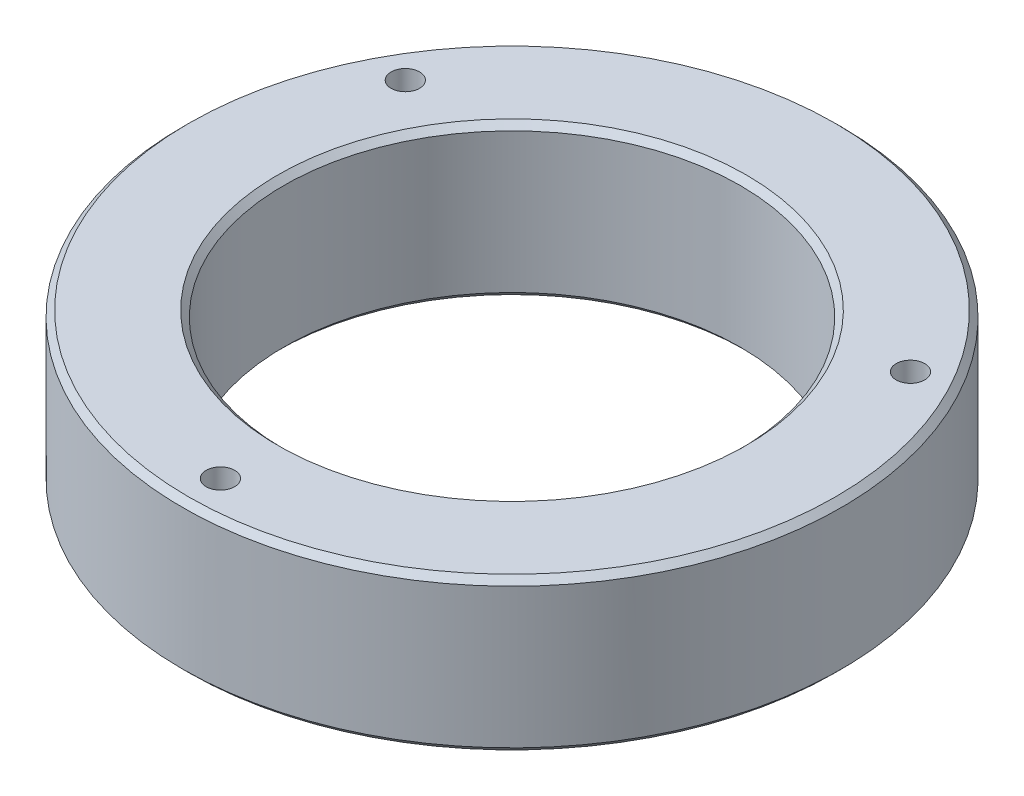
ISO-10303-21;
HEADER;
FILE_DESCRIPTION(('STEP AP214'),'2;1');
FILE_NAME('part.step','',(''),(''),'','','');
FILE_SCHEMA(('AUTOMOTIVE_DESIGN { 1 0 10303 214 1 1 1 1 }'));
ENDSEC;
DATA;
#1=APPLICATION_CONTEXT('core data for automotive mechanical design processes');
#2=APPLICATION_PROTOCOL_DEFINITION('international standard','automotive_design',2000,#1);
#3=PRODUCT_CONTEXT('',#1,'mechanical');
#4=PRODUCT('Part','Part','',(#3));
#5=PRODUCT_RELATED_PRODUCT_CATEGORY('part','',(#4));
#6=PRODUCT_DEFINITION_FORMATION('','',#4);
#7=PRODUCT_DEFINITION_CONTEXT('part definition',#1,'design');
#8=PRODUCT_DEFINITION('design','',#6,#7);
#9=PRODUCT_DEFINITION_SHAPE('','',#8);
#10=(LENGTH_UNIT() NAMED_UNIT(*) SI_UNIT(.MILLI.,.METRE.));
#11=(NAMED_UNIT(*) PLANE_ANGLE_UNIT() SI_UNIT($,.RADIAN.));
#12=(NAMED_UNIT(*) SI_UNIT($,.STERADIAN.) SOLID_ANGLE_UNIT());
#13=UNCERTAINTY_MEASURE_WITH_UNIT(LENGTH_MEASURE(1.E-05),#10,'distance_accuracy_value','');
#14=(GEOMETRIC_REPRESENTATION_CONTEXT(3) GLOBAL_UNCERTAINTY_ASSIGNED_CONTEXT((#13)) GLOBAL_UNIT_ASSIGNED_CONTEXT((#10,
#11,#12)) REPRESENTATION_CONTEXT('',''));
#15=CARTESIAN_POINT('',(0.,0.,0.));
#16=DIRECTION('',(0.,0.,1.));
#17=DIRECTION('',(1.,0.,0.));
#18=AXIS2_PLACEMENT_3D('',#15,#16,#17);
#19=CARTESIAN_POINT('',(-57.15,-19.05,0.));
#20=DIRECTION('',(0.,1.,0.));
#21=DIRECTION('',(0.,0.,1.));
#22=AXIS2_PLACEMENT_3D('',#19,#20,#21);
#23=PLANE('',#22);
#24=CARTESIAN_POINT('',(0.,-19.05,0.));
#25=DIRECTION('',(0.,1.,0.));
#26=DIRECTION('',(0.,0.,1.));
#27=AXIS2_PLACEMENT_3D('',#24,#25,#26);
#28=CIRCLE('',#27,58.674);
#29=CARTESIAN_POINT('',(0.,-19.05,-58.674));
#30=VERTEX_POINT('',#29);
#31=EDGE_CURVE('E134',#30,#30,#28,.T.);
#32=ORIENTED_EDGE('',*,*,#31,.T.);
#33=EDGE_LOOP('',(#32));
#34=FACE_BOUND('',#33,.T.);
#35=CARTESIAN_POINT('',(0.,-19.05,0.));
#36=DIRECTION('',(0.,1.,0.));
#37=DIRECTION('',(0.,0.,1.));
#38=AXIS2_PLACEMENT_3D('',#35,#36,#37);
#39=CIRCLE('',#38,81.0006);
#40=CARTESIAN_POINT('',(0.,-19.05,81.0006));
#41=VERTEX_POINT('',#40);
#42=EDGE_CURVE('E131',#41,#41,#39,.F.);
#43=ORIENTED_EDGE('',*,*,#42,.T.);
#44=EDGE_LOOP('',(#43));
#45=FACE_BOUND('',#44,.T.);
#46=CARTESIAN_POINT('',(69.85,-19.05,0.));
#47=DIRECTION('',(0.,-1.,0.));
#48=DIRECTION('',(0.,0.,-1.));
#49=AXIS2_PLACEMENT_3D('',#46,#47,#48);
#50=CIRCLE('',#49,3.96874999999999);
#51=CARTESIAN_POINT('',(69.85,-19.05,-3.96874999999999));
#52=VERTEX_POINT('',#51);
#53=EDGE_CURVE('E73',#52,#52,#50,.T.);
#54=ORIENTED_EDGE('',*,*,#53,.F.);
#55=EDGE_LOOP('',(#54));
#56=FACE_BOUND('',#55,.T.);
#57=CARTESIAN_POINT('',(-69.85,-19.05,0.));
#58=DIRECTION('',(0.,-1.,0.));
#59=DIRECTION('',(0.,0.,-1.));
#60=AXIS2_PLACEMENT_3D('',#57,#58,#59);
#61=CIRCLE('',#60,3.96874999999999);
#62=CARTESIAN_POINT('',(-69.85,-19.05,-3.96874999999999));
#63=VERTEX_POINT('',#62);
#64=EDGE_CURVE('E72',#63,#63,#61,.T.);
#65=ORIENTED_EDGE('',*,*,#64,.F.);
#66=EDGE_LOOP('',(#65));
#67=FACE_BOUND('',#66,.T.);
#68=CARTESIAN_POINT('',(0.,-19.05,73.025));
#69=DIRECTION('',(0.,-1.,0.));
#70=DIRECTION('',(0.,0.,-1.));
#71=AXIS2_PLACEMENT_3D('',#68,#69,#70);
#72=CIRCLE('',#71,5.56259999999999);
#73=CARTESIAN_POINT('',(0.,-19.05,67.4624));
#74=VERTEX_POINT('',#73);
#75=EDGE_CURVE('E83',#74,#74,#72,.T.);
#76=ORIENTED_EDGE('',*,*,#75,.F.);
#77=EDGE_LOOP('',(#76));
#78=FACE_BOUND('',#77,.T.);
#79=CARTESIAN_POINT('',(63.246,-19.05,-36.5252));
#80=DIRECTION('',(0.,-1.,0.));
#81=DIRECTION('',(0.,0.,-1.));
#82=AXIS2_PLACEMENT_3D('',#79,#80,#81);
#83=CIRCLE('',#82,5.5626);
#84=CARTESIAN_POINT('',(63.246,-19.05,-42.0878));
#85=VERTEX_POINT('',#84);
#86=EDGE_CURVE('E95',#85,#85,#83,.T.);
#87=ORIENTED_EDGE('',*,*,#86,.F.);
#88=EDGE_LOOP('',(#87));
#89=FACE_BOUND('',#88,.T.);
#90=CARTESIAN_POINT('',(-63.246,-19.05,-36.5252));
#91=DIRECTION('',(0.,-1.,0.));
#92=DIRECTION('',(0.,0.,-1.));
#93=AXIS2_PLACEMENT_3D('',#90,#91,#92);
#94=CIRCLE('',#93,5.56259999999999);
#95=CARTESIAN_POINT('',(-63.246,-19.05,-42.0878));
#96=VERTEX_POINT('',#95);
#97=EDGE_CURVE('E107',#96,#96,#94,.T.);
#98=ORIENTED_EDGE('',*,*,#97,.F.);
#99=EDGE_LOOP('',(#98));
#100=FACE_BOUND('',#99,.T.);
#101=ADVANCED_FACE('F47',(#34,#45,#56,#67,#78,#89,#100),#23,.F.);
#102=CARTESIAN_POINT('',(0.,-44.45,0.));
#103=DIRECTION('',(0.,-1.,0.));
#104=DIRECTION('',(0.,0.,-1.));
#105=AXIS2_PLACEMENT_3D('',#102,#103,#104);
#106=CYLINDRICAL_SURFACE('',#105,82.5246);
#107=CARTESIAN_POINT('',(0.,17.526,0.));
#108=DIRECTION('',(0.,-1.,0.));
#109=DIRECTION('',(0.,0.,-1.));
#110=AXIS2_PLACEMENT_3D('',#107,#108,#109);
#111=CIRCLE('',#110,82.5246);
#112=CARTESIAN_POINT('',(0.,17.526,-82.5246));
#113=VERTEX_POINT('',#112);
#114=EDGE_CURVE('E11',#113,#113,#111,.T.);
#115=ORIENTED_EDGE('',*,*,#114,.T.);
#116=EDGE_LOOP('',(#115));
#117=FACE_BOUND('',#116,.T.);
#118=CARTESIAN_POINT('',(0.,-17.526,0.));
#119=DIRECTION('',(0.,1.,0.));
#120=DIRECTION('',(0.,0.,1.));
#121=AXIS2_PLACEMENT_3D('',#118,#119,#120);
#122=CIRCLE('',#121,82.5246);
#123=CARTESIAN_POINT('',(0.,-17.526,82.5246));
#124=VERTEX_POINT('',#123);
#125=EDGE_CURVE('E56',#124,#124,#122,.T.);
#126=ORIENTED_EDGE('',*,*,#125,.T.);
#127=EDGE_LOOP('',(#126));
#128=FACE_BOUND('',#127,.T.);
#129=ADVANCED_FACE('F139',(#117,#128),#106,.T.);
#130=CARTESIAN_POINT('',(-82.5246,19.05,0.));
#131=DIRECTION('',(0.,-1.,0.));
#132=DIRECTION('',(0.,0.,-1.));
#133=AXIS2_PLACEMENT_3D('',#130,#131,#132);
#134=PLANE('',#133);
#135=CARTESIAN_POINT('',(0.,19.05,0.));
#136=DIRECTION('',(0.,-1.,0.));
#137=DIRECTION('',(0.,0.,-1.));
#138=AXIS2_PLACEMENT_3D('',#135,#136,#137);
#139=CIRCLE('',#138,58.674);
#140=CARTESIAN_POINT('',(0.,19.05,-58.674));
#141=VERTEX_POINT('',#140);
#142=EDGE_CURVE('E122',#141,#141,#139,.T.);
#143=ORIENTED_EDGE('',*,*,#142,.T.);
#144=EDGE_LOOP('',(#143));
#145=FACE_BOUND('',#144,.T.);
#146=CARTESIAN_POINT('',(0.,19.05,0.));
#147=DIRECTION('',(0.,-1.,0.));
#148=DIRECTION('',(0.,0.,-1.));
#149=AXIS2_PLACEMENT_3D('',#146,#147,#148);
#150=CIRCLE('',#149,81.0006);
#151=CARTESIAN_POINT('',(0.,19.05,-81.0006));
#152=VERTEX_POINT('',#151);
#153=EDGE_CURVE('E119',#152,#152,#150,.F.);
#154=ORIENTED_EDGE('',*,*,#153,.T.);
#155=EDGE_LOOP('',(#154));
#156=FACE_BOUND('',#155,.T.);
#157=CARTESIAN_POINT('',(0.,19.05,73.025));
#158=DIRECTION('',(0.,-1.,0.));
#159=DIRECTION('',(0.,0.,-1.));
#160=AXIS2_PLACEMENT_3D('',#157,#158,#159);
#161=CIRCLE('',#160,3.56869999999999);
#162=CARTESIAN_POINT('',(0.,19.05,69.4563));
#163=VERTEX_POINT('',#162);
#164=EDGE_CURVE('E92',#163,#163,#161,.T.);
#165=ORIENTED_EDGE('',*,*,#164,.T.);
#166=EDGE_LOOP('',(#165));
#167=FACE_BOUND('',#166,.T.);
#168=CARTESIAN_POINT('',(63.246,19.05,-36.5252));
#169=DIRECTION('',(0.,-1.,0.));
#170=DIRECTION('',(0.,0.,-1.));
#171=AXIS2_PLACEMENT_3D('',#168,#169,#170);
#172=CIRCLE('',#171,3.56869999999999);
#173=CARTESIAN_POINT('',(63.246,19.05,-40.0939));
#174=VERTEX_POINT('',#173);
#175=EDGE_CURVE('E104',#174,#174,#172,.T.);
#176=ORIENTED_EDGE('',*,*,#175,.T.);
#177=EDGE_LOOP('',(#176));
#178=FACE_BOUND('',#177,.T.);
#179=CARTESIAN_POINT('',(-63.246,19.05,-36.5252));
#180=DIRECTION('',(0.,-1.,0.));
#181=DIRECTION('',(0.,0.,-1.));
#182=AXIS2_PLACEMENT_3D('',#179,#180,#181);
#183=CIRCLE('',#182,3.56869999999999);
#184=CARTESIAN_POINT('',(-63.246,19.05,-40.0939));
#185=VERTEX_POINT('',#184);
#186=EDGE_CURVE('E116',#185,#185,#183,.T.);
#187=ORIENTED_EDGE('',*,*,#186,.T.);
#188=EDGE_LOOP('',(#187));
#189=FACE_BOUND('',#188,.T.);
#190=ADVANCED_FACE('F185',(#145,#156,#167,#178,#189),#134,.F.);
#191=CARTESIAN_POINT('',(0.,-44.45,0.));
#192=DIRECTION('',(0.,-1.,0.));
#193=DIRECTION('',(0.,0.,-1.));
#194=AXIS2_PLACEMENT_3D('',#191,#192,#193);
#195=CYLINDRICAL_SURFACE('',#194,57.15);
#196=CARTESIAN_POINT('',(0.,17.526,0.));
#197=DIRECTION('',(0.,-1.,0.));
#198=DIRECTION('',(0.,0.,-1.));
#199=AXIS2_PLACEMENT_3D('',#196,#197,#198);
#200=CIRCLE('',#199,57.15);
#201=CARTESIAN_POINT('',(0.,17.526,-57.15));
#202=VERTEX_POINT('',#201);
#203=EDGE_CURVE('E128',#202,#202,#200,.F.);
#204=CARTESIAN_POINT('',(0.,-17.526,0.));
#205=DIRECTION('',(0.,1.,0.));
#206=DIRECTION('',(0.,0.,1.));
#207=AXIS2_PLACEMENT_3D('',#204,#205,#206);
#208=CIRCLE('',#207,57.15);
#209=CARTESIAN_POINT('',(0.,-17.526,-57.15));
#210=VERTEX_POINT('',#209);
#211=EDGE_CURVE('E125',#210,#210,#208,.F.);
#212=CARTESIAN_POINT('',(0.,17.526,-57.15));
#213=CARTESIAN_POINT('',(0.,17.160875,-57.15));
#214=CARTESIAN_POINT('',(0.,16.79575,-57.15));
#215=CARTESIAN_POINT('',(0.,16.0655,-57.15));
#216=CARTESIAN_POINT('',(0.,15.700375,-57.15));
#217=CARTESIAN_POINT('',(0.,14.970125,-57.15));
#218=CARTESIAN_POINT('',(0.,14.605,-57.15));
#219=CARTESIAN_POINT('',(0.,13.87475,-57.15));
#220=CARTESIAN_POINT('',(0.,13.509625,-57.15));
#221=CARTESIAN_POINT('',(0.,12.779375,-57.15));
#222=CARTESIAN_POINT('',(0.,12.41425,-57.15));
#223=CARTESIAN_POINT('',(0.,11.684,-57.15));
#224=CARTESIAN_POINT('',(0.,11.318875,-57.15));
#225=CARTESIAN_POINT('',(0.,10.588625,-57.15));
#226=CARTESIAN_POINT('',(0.,10.2235,-57.15));
#227=CARTESIAN_POINT('',(0.,9.49324999999998,-57.15));
#228=CARTESIAN_POINT('',(0.,9.12812499999998,-57.15));
#229=CARTESIAN_POINT('',(0.,8.39787499999998,-57.15));
#230=CARTESIAN_POINT('',(0.,8.03274999999998,-57.15));
#231=CARTESIAN_POINT('',(0.,7.30249999999998,-57.15));
#232=CARTESIAN_POINT('',(0.,6.93737499999998,-57.15));
#233=CARTESIAN_POINT('',(0.,6.20712499999998,-57.15));
#234=CARTESIAN_POINT('',(0.,5.84199999999998,-57.15));
#235=CARTESIAN_POINT('',(0.,5.11174999999998,-57.15));
#236=CARTESIAN_POINT('',(0.,4.74662499999998,-57.15));
#237=CARTESIAN_POINT('',(0.,4.01637499999998,-57.15));
#238=CARTESIAN_POINT('',(0.,3.65124999999998,-57.15));
#239=CARTESIAN_POINT('',(0.,2.92099999999998,-57.15));
#240=CARTESIAN_POINT('',(0.,2.55587499999998,-57.15));
#241=CARTESIAN_POINT('',(0.,1.82562499999998,-57.15));
#242=CARTESIAN_POINT('',(0.,1.46049999999998,-57.15));
#243=CARTESIAN_POINT('',(0.,0.730249999999976,-57.15));
#244=CARTESIAN_POINT('',(0.,0.365124999999978,-57.15));
#245=CARTESIAN_POINT('',(0.,-0.365125000000019,-57.15));
#246=CARTESIAN_POINT('',(0.,-0.730250000000018,-57.15));
#247=CARTESIAN_POINT('',(0.,-1.46050000000002,-57.15));
#248=CARTESIAN_POINT('',(0.,-1.82562500000002,-57.15));
#249=CARTESIAN_POINT('',(0.,-2.55587500000002,-57.15));
#250=CARTESIAN_POINT('',(0.,-2.92100000000002,-57.15));
#251=CARTESIAN_POINT('',(0.,-3.65125000000002,-57.15));
#252=CARTESIAN_POINT('',(0.,-4.01637500000002,-57.15));
#253=CARTESIAN_POINT('',(0.,-4.74662500000002,-57.15));
#254=CARTESIAN_POINT('',(0.,-5.11175000000002,-57.15));
#255=CARTESIAN_POINT('',(0.,-5.84200000000002,-57.15));
#256=CARTESIAN_POINT('',(0.,-6.20712500000002,-57.15));
#257=CARTESIAN_POINT('',(0.,-6.93737500000002,-57.15));
#258=CARTESIAN_POINT('',(0.,-7.30250000000002,-57.15));
#259=CARTESIAN_POINT('',(0.,-8.03275000000002,-57.15));
#260=CARTESIAN_POINT('',(0.,-8.39787500000002,-57.15));
#261=CARTESIAN_POINT('',(0.,-9.12812500000002,-57.15));
#262=CARTESIAN_POINT('',(0.,-9.49325000000002,-57.15));
#263=CARTESIAN_POINT('',(0.,-10.2235,-57.15));
#264=CARTESIAN_POINT('',(0.,-10.588625,-57.15));
#265=CARTESIAN_POINT('',(0.,-11.318875,-57.15));
#266=CARTESIAN_POINT('',(0.,-11.684,-57.15));
#267=CARTESIAN_POINT('',(0.,-12.41425,-57.15));
#268=CARTESIAN_POINT('',(0.,-12.779375,-57.15));
#269=CARTESIAN_POINT('',(0.,-13.509625,-57.15));
#270=CARTESIAN_POINT('',(0.,-13.87475,-57.15));
#271=CARTESIAN_POINT('',(0.,-14.605,-57.15));
#272=CARTESIAN_POINT('',(0.,-14.970125,-57.15));
#273=CARTESIAN_POINT('',(0.,-15.700375,-57.15));
#274=CARTESIAN_POINT('',(0.,-16.0655,-57.15));
#275=CARTESIAN_POINT('',(0.,-16.79575,-57.15));
#276=CARTESIAN_POINT('',(0.,-17.160875,-57.15));
#277=CARTESIAN_POINT('',(0.,-17.526,-57.15));
#278=B_SPLINE_CURVE_WITH_KNOTS('',3,(#212,#213,#214,#215,#216,#217,#218,#219,#220,#221,#222,
#223,#224,#225,#226,#227,#228,#229,#230,#231,#232,#233,#234,#235,#236,#237,#238,#239,#240,#241,
#242,#243,#244,#245,#246,#247,#248,#249,#250,#251,#252,#253,#254,#255,#256,#257,#258,#259,#260,
#261,#262,#263,#264,#265,#266,#267,#268,#269,#270,#271,#272,#273,#274,#275,#276,#277),
.UNSPECIFIED.,.F.,.F.,(4,2,2,2,2,2,2,2,2,2,2,2,2,2,2,2,2,2,2,2,2,2,2,2,2,2,2,2,2,2,2,2,4),(0.,
1.095375,2.19075,3.286125,4.3815,5.476875,6.57225,7.667625,8.763,9.858375,10.95375,12.049125,
13.1445,14.239875,15.33525,16.430625,17.526,18.621375,19.71675,20.812125,21.9075,23.002875,
24.09825,25.193625,26.289,27.384375,28.47975,29.575125,30.6705,31.765875,32.86125,33.956625,
35.052),.UNSPECIFIED.);
#279=EDGE_CURVE('BSEAM181',#202,#210,#278,.T.);
#280=ORIENTED_EDGE('',*,*,#203,.T.);
#281=ORIENTED_EDGE('',*,*,#211,.T.);
#282=ORIENTED_EDGE('',*,*,#279,.T.);
#283=ORIENTED_EDGE('',*,*,#279,.F.);
#284=EDGE_LOOP('',(#280,#282,#281,#283));
#285=FACE_BOUND('',#284,.T.);
#286=ADVANCED_FACE('F181',(#285),#195,.F.);
#287=CARTESIAN_POINT('',(-63.246,-19.05,-36.5252));
#288=DIRECTION('',(0.,-1.,0.));
#289=DIRECTION('',(0.,0.,-1.));
#290=AXIS2_PLACEMENT_3D('',#287,#288,#289);
#291=CYLINDRICAL_SURFACE('',#290,3.56869999999999);
#292=ORIENTED_EDGE('',*,*,#186,.F.);
#293=EDGE_LOOP('',(#292));
#294=FACE_BOUND('',#293,.T.);
#295=CARTESIAN_POINT('',(-63.246,-9.39800000000001,-36.5252));
#296=DIRECTION('',(0.,-1.,0.));
#297=DIRECTION('',(0.,0.,-1.));
#298=AXIS2_PLACEMENT_3D('',#295,#296,#297);
#299=CIRCLE('',#298,3.56869999999999);
#300=CARTESIAN_POINT('',(-63.246,-9.39800000000001,-40.0939));
#301=VERTEX_POINT('',#300);
#302=EDGE_CURVE('E113',#301,#301,#299,.T.);
#303=ORIENTED_EDGE('',*,*,#302,.T.);
#304=EDGE_LOOP('',(#303));
#305=FACE_BOUND('',#304,.T.);
#306=ADVANCED_FACE('F173',(#294,#305),#291,.F.);
#307=CARTESIAN_POINT('',(-59.6773,-9.398,-36.5252));
#308=DIRECTION('',(0.,1.,0.));
#309=DIRECTION('',(0.,0.,1.));
#310=AXIS2_PLACEMENT_3D('',#307,#308,#309);
#311=PLANE('',#310);
#312=ORIENTED_EDGE('',*,*,#302,.F.);
#313=EDGE_LOOP('',(#312));
#314=FACE_BOUND('',#313,.T.);
#315=CARTESIAN_POINT('',(-63.246,-9.398,-36.5252));
#316=DIRECTION('',(0.,-1.,0.));
#317=DIRECTION('',(0.,0.,-1.));
#318=AXIS2_PLACEMENT_3D('',#315,#316,#317);
#319=CIRCLE('',#318,5.56259999999999);
#320=CARTESIAN_POINT('',(-63.246,-9.398,-42.0878));
#321=VERTEX_POINT('',#320);
#322=EDGE_CURVE('E110',#321,#321,#319,.T.);
#323=ORIENTED_EDGE('',*,*,#322,.T.);
#324=EDGE_LOOP('',(#323));
#325=FACE_BOUND('',#324,.T.);
#326=ADVANCED_FACE('F163',(#314,#325),#311,.F.);
#327=CARTESIAN_POINT('',(-63.246,-19.05,-36.5252));
#328=DIRECTION('',(0.,-1.,0.));
#329=DIRECTION('',(0.,0.,-1.));
#330=AXIS2_PLACEMENT_3D('',#327,#328,#329);
#331=CYLINDRICAL_SURFACE('',#330,5.56259999999999);
#332=ORIENTED_EDGE('',*,*,#322,.F.);
#333=EDGE_LOOP('',(#332));
#334=FACE_BOUND('',#333,.T.);
#335=ORIENTED_EDGE('',*,*,#97,.T.);
#336=EDGE_LOOP('',(#335));
#337=FACE_BOUND('',#336,.T.);
#338=ADVANCED_FACE('F160',(#334,#337),#331,.F.);
#339=CARTESIAN_POINT('',(63.246,-19.05,-36.5252));
#340=DIRECTION('',(0.,-1.,0.));
#341=DIRECTION('',(0.,0.,-1.));
#342=AXIS2_PLACEMENT_3D('',#339,#340,#341);
#343=CYLINDRICAL_SURFACE('',#342,3.56869999999999);
#344=ORIENTED_EDGE('',*,*,#175,.F.);
#345=EDGE_LOOP('',(#344));
#346=FACE_BOUND('',#345,.T.);
#347=CARTESIAN_POINT('',(63.246,-9.39800000000001,-36.5252));
#348=DIRECTION('',(0.,-1.,0.));
#349=DIRECTION('',(0.,0.,-1.));
#350=AXIS2_PLACEMENT_3D('',#347,#348,#349);
#351=CIRCLE('',#350,3.56869999999998);
#352=CARTESIAN_POINT('',(63.246,-9.39800000000001,-40.0939));
#353=VERTEX_POINT('',#352);
#354=EDGE_CURVE('E101',#353,#353,#351,.T.);
#355=ORIENTED_EDGE('',*,*,#354,.T.);
#356=EDGE_LOOP('',(#355));
#357=FACE_BOUND('',#356,.T.);
#358=ADVANCED_FACE('F162',(#346,#357),#343,.F.);
#359=CARTESIAN_POINT('',(66.8147,-9.398,-36.5252));
#360=DIRECTION('',(0.,1.,0.));
#361=DIRECTION('',(0.,0.,1.));
#362=AXIS2_PLACEMENT_3D('',#359,#360,#361);
#363=PLANE('',#362);
#364=ORIENTED_EDGE('',*,*,#354,.F.);
#365=EDGE_LOOP('',(#364));
#366=FACE_BOUND('',#365,.T.);
#367=CARTESIAN_POINT('',(63.246,-9.398,-36.5252));
#368=DIRECTION('',(0.,-1.,0.));
#369=DIRECTION('',(0.,0.,-1.));
#370=AXIS2_PLACEMENT_3D('',#367,#368,#369);
#371=CIRCLE('',#370,5.5626);
#372=CARTESIAN_POINT('',(63.246,-9.398,-42.0878));
#373=VERTEX_POINT('',#372);
#374=EDGE_CURVE('E98',#373,#373,#371,.T.);
#375=ORIENTED_EDGE('',*,*,#374,.T.);
#376=EDGE_LOOP('',(#375));
#377=FACE_BOUND('',#376,.T.);
#378=ADVANCED_FACE('F170',(#366,#377),#363,.F.);
#379=CARTESIAN_POINT('',(63.246,-19.05,-36.5252));
#380=DIRECTION('',(0.,-1.,0.));
#381=DIRECTION('',(0.,0.,-1.));
#382=AXIS2_PLACEMENT_3D('',#379,#380,#381);
#383=CYLINDRICAL_SURFACE('',#382,5.5626);
#384=ORIENTED_EDGE('',*,*,#374,.F.);
#385=EDGE_LOOP('',(#384));
#386=FACE_BOUND('',#385,.T.);
#387=ORIENTED_EDGE('',*,*,#86,.T.);
#388=EDGE_LOOP('',(#387));
#389=FACE_BOUND('',#388,.T.);
#390=ADVANCED_FACE('F231',(#386,#389),#383,.F.);
#391=CARTESIAN_POINT('',(0.,-19.05,73.025));
#392=DIRECTION('',(0.,-1.,0.));
#393=DIRECTION('',(0.,0.,-1.));
#394=AXIS2_PLACEMENT_3D('',#391,#392,#393);
#395=CYLINDRICAL_SURFACE('',#394,3.56869999999999);
#396=ORIENTED_EDGE('',*,*,#164,.F.);
#397=EDGE_LOOP('',(#396));
#398=FACE_BOUND('',#397,.T.);
#399=CARTESIAN_POINT('',(0.,-9.39800000000001,73.025));
#400=DIRECTION('',(0.,-1.,0.));
#401=DIRECTION('',(0.,0.,-1.));
#402=AXIS2_PLACEMENT_3D('',#399,#400,#401);
#403=CIRCLE('',#402,3.56869999999999);
#404=CARTESIAN_POINT('',(0.,-9.39800000000001,69.4563));
#405=VERTEX_POINT('',#404);
#406=EDGE_CURVE('E89',#405,#405,#403,.T.);
#407=ORIENTED_EDGE('',*,*,#406,.T.);
#408=EDGE_LOOP('',(#407));
#409=FACE_BOUND('',#408,.T.);
#410=ADVANCED_FACE('F236',(#398,#409),#395,.F.);
#411=CARTESIAN_POINT('',(3.56869999999999,-9.398,73.025));
#412=DIRECTION('',(0.,1.,0.));
#413=DIRECTION('',(0.,0.,1.));
#414=AXIS2_PLACEMENT_3D('',#411,#412,#413);
#415=PLANE('',#414);
#416=ORIENTED_EDGE('',*,*,#406,.F.);
#417=EDGE_LOOP('',(#416));
#418=FACE_BOUND('',#417,.T.);
#419=CARTESIAN_POINT('',(0.,-9.398,73.025));
#420=DIRECTION('',(0.,-1.,0.));
#421=DIRECTION('',(0.,0.,-1.));
#422=AXIS2_PLACEMENT_3D('',#419,#420,#421);
#423=CIRCLE('',#422,5.56259999999999);
#424=CARTESIAN_POINT('',(0.,-9.398,67.4624));
#425=VERTEX_POINT('',#424);
#426=EDGE_CURVE('E86',#425,#425,#423,.T.);
#427=ORIENTED_EDGE('',*,*,#426,.T.);
#428=EDGE_LOOP('',(#427));
#429=FACE_BOUND('',#428,.T.);
#430=ADVANCED_FACE('F241',(#418,#429),#415,.F.);
#431=CARTESIAN_POINT('',(0.,-19.05,73.025));
#432=DIRECTION('',(0.,-1.,0.));
#433=DIRECTION('',(0.,0.,-1.));
#434=AXIS2_PLACEMENT_3D('',#431,#432,#433);
#435=CYLINDRICAL_SURFACE('',#434,5.56259999999999);
#436=ORIENTED_EDGE('',*,*,#426,.F.);
#437=EDGE_LOOP('',(#436));
#438=FACE_BOUND('',#437,.T.);
#439=ORIENTED_EDGE('',*,*,#75,.T.);
#440=EDGE_LOOP('',(#439));
#441=FACE_BOUND('',#440,.T.);
#442=ADVANCED_FACE('F247',(#438,#441),#435,.F.);
#443=CARTESIAN_POINT('',(-69.85,6.35000000000001,0.));
#444=DIRECTION('',(0.,-1.,0.));
#445=DIRECTION('',(0.,0.,-1.));
#446=AXIS2_PLACEMENT_3D('',#443,#444,#445);
#447=CONICAL_SURFACE('',#446,3.96874999999999,1.02974425867665);
#448=CARTESIAN_POINT('',(-69.85,8.73466558176564,0.));
#449=VERTEX_POINT('',#448);
#450=VERTEX_LOOP('',#449);
#451=FACE_BOUND('',#450,.T.);
#452=CARTESIAN_POINT('',(-69.85,6.35000000000001,0.));
#453=DIRECTION('',(0.,-1.,0.));
#454=DIRECTION('',(0.,0.,-1.));
#455=AXIS2_PLACEMENT_3D('',#452,#453,#454);
#456=CIRCLE('',#455,3.96874999999999);
#457=CARTESIAN_POINT('',(-69.85,6.35000000000001,-3.96874999999999));
#458=VERTEX_POINT('',#457);
#459=EDGE_CURVE('E76',#458,#458,#456,.T.);
#460=ORIENTED_EDGE('',*,*,#459,.T.);
#461=EDGE_LOOP('',(#460));
#462=FACE_BOUND('',#461,.T.);
#463=ADVANCED_FACE('F251',(#451,#462),#447,.F.);
#464=CARTESIAN_POINT('',(-69.85,-19.05,0.));
#465=DIRECTION('',(0.,-1.,0.));
#466=DIRECTION('',(0.,0.,-1.));
#467=AXIS2_PLACEMENT_3D('',#464,#465,#466);
#468=CYLINDRICAL_SURFACE('',#467,3.96874999999999);
#469=ORIENTED_EDGE('',*,*,#459,.F.);
#470=EDGE_LOOP('',(#469));
#471=FACE_BOUND('',#470,.T.);
#472=ORIENTED_EDGE('',*,*,#64,.T.);
#473=EDGE_LOOP('',(#472));
#474=FACE_BOUND('',#473,.T.);
#475=ADVANCED_FACE('F66',(#471,#474),#468,.F.);
#476=CARTESIAN_POINT('',(69.85,6.35000000000001,0.));
#477=DIRECTION('',(0.,-1.,0.));
#478=DIRECTION('',(0.,0.,-1.));
#479=AXIS2_PLACEMENT_3D('',#476,#477,#478);
#480=CONICAL_SURFACE('',#479,3.96874999999999,1.02974425867665);
#481=CARTESIAN_POINT('',(69.85,8.73466558176564,0.));
#482=VERTEX_POINT('',#481);
#483=VERTEX_LOOP('',#482);
#484=FACE_BOUND('',#483,.T.);
#485=CARTESIAN_POINT('',(69.85,6.35000000000001,0.));
#486=DIRECTION('',(0.,-1.,0.));
#487=DIRECTION('',(0.,0.,-1.));
#488=AXIS2_PLACEMENT_3D('',#485,#486,#487);
#489=CIRCLE('',#488,3.96874999999999);
#490=CARTESIAN_POINT('',(69.85,6.35000000000001,-3.96874999999999));
#491=VERTEX_POINT('',#490);
#492=EDGE_CURVE('E70',#491,#491,#489,.T.);
#493=ORIENTED_EDGE('',*,*,#492,.T.);
#494=EDGE_LOOP('',(#493));
#495=FACE_BOUND('',#494,.T.);
#496=ADVANCED_FACE('F62',(#484,#495),#480,.F.);
#497=CARTESIAN_POINT('',(69.85,-19.05,0.));
#498=DIRECTION('',(0.,-1.,0.));
#499=DIRECTION('',(0.,0.,-1.));
#500=AXIS2_PLACEMENT_3D('',#497,#498,#499);
#501=CYLINDRICAL_SURFACE('',#500,3.96874999999999);
#502=ORIENTED_EDGE('',*,*,#492,.F.);
#503=EDGE_LOOP('',(#502));
#504=FACE_BOUND('',#503,.T.);
#505=ORIENTED_EDGE('',*,*,#53,.T.);
#506=EDGE_LOOP('',(#505));
#507=FACE_BOUND('',#506,.T.);
#508=ADVANCED_FACE('F65',(#504,#507),#501,.F.);
#509=CARTESIAN_POINT('',(0.,19.05,0.));
#510=DIRECTION('',(0.,1.,0.));
#511=DIRECTION('',(0.,0.,1.));
#512=AXIS2_PLACEMENT_3D('',#509,#510,#511);
#513=CONICAL_SURFACE('',#512,58.674,0.785398163397435);
#514=ORIENTED_EDGE('',*,*,#203,.F.);
#515=EDGE_LOOP('',(#514));
#516=FACE_BOUND('',#515,.T.);
#517=ORIENTED_EDGE('',*,*,#142,.F.);
#518=EDGE_LOOP('',(#517));
#519=FACE_BOUND('',#518,.T.);
#520=ADVANCED_FACE('F194',(#516,#519),#513,.F.);
#521=CARTESIAN_POINT('',(0.,-17.526,0.));
#522=DIRECTION('',(0.,-1.,0.));
#523=DIRECTION('',(0.,0.,-1.));
#524=AXIS2_PLACEMENT_3D('',#521,#522,#523);
#525=CONICAL_SURFACE('',#524,57.15,0.785398163397451);
#526=CARTESIAN_POINT('',(0.,-19.05,-58.674));
#527=CARTESIAN_POINT('',(0.,-19.034125,-58.658125));
#528=CARTESIAN_POINT('',(0.,-19.01825,-58.64225));
#529=CARTESIAN_POINT('',(0.,-18.9865,-58.6105));
#530=CARTESIAN_POINT('',(0.,-18.970625,-58.594625));
#531=CARTESIAN_POINT('',(0.,-18.938875,-58.562875));
#532=CARTESIAN_POINT('',(0.,-18.923,-58.547));
#533=CARTESIAN_POINT('',(0.,-18.89125,-58.51525));
#534=CARTESIAN_POINT('',(0.,-18.875375,-58.499375));
#535=CARTESIAN_POINT('',(0.,-18.843625,-58.467625));
#536=CARTESIAN_POINT('',(0.,-18.82775,-58.45175));
#537=CARTESIAN_POINT('',(0.,-18.796,-58.42));
#538=CARTESIAN_POINT('',(0.,-18.780125,-58.404125));
#539=CARTESIAN_POINT('',(0.,-18.748375,-58.372375));
#540=CARTESIAN_POINT('',(0.,-18.7325,-58.3565));
#541=CARTESIAN_POINT('',(0.,-18.70075,-58.32475));
#542=CARTESIAN_POINT('',(0.,-18.684875,-58.308875));
#543=CARTESIAN_POINT('',(0.,-18.653125,-58.277125));
#544=CARTESIAN_POINT('',(0.,-18.63725,-58.26125));
#545=CARTESIAN_POINT('',(0.,-18.6055,-58.2295));
#546=CARTESIAN_POINT('',(0.,-18.589625,-58.213625));
#547=CARTESIAN_POINT('',(0.,-18.557875,-58.181875));
#548=CARTESIAN_POINT('',(0.,-18.542,-58.166));
#549=CARTESIAN_POINT('',(0.,-18.51025,-58.13425));
#550=CARTESIAN_POINT('',(0.,-18.494375,-58.118375));
#551=CARTESIAN_POINT('',(0.,-18.462625,-58.086625));
#552=CARTESIAN_POINT('',(0.,-18.44675,-58.07075));
#553=CARTESIAN_POINT('',(0.,-18.415,-58.039));
#554=CARTESIAN_POINT('',(0.,-18.399125,-58.023125));
#555=CARTESIAN_POINT('',(0.,-18.367375,-57.991375));
#556=CARTESIAN_POINT('',(0.,-18.3515,-57.9755));
#557=CARTESIAN_POINT('',(0.,-18.31975,-57.94375));
#558=CARTESIAN_POINT('',(0.,-18.303875,-57.927875));
#559=CARTESIAN_POINT('',(0.,-18.272125,-57.896125));
#560=CARTESIAN_POINT('',(0.,-18.25625,-57.88025));
#561=CARTESIAN_POINT('',(0.,-18.2245,-57.8485));
#562=CARTESIAN_POINT('',(0.,-18.208625,-57.832625));
#563=CARTESIAN_POINT('',(0.,-18.176875,-57.800875));
#564=CARTESIAN_POINT('',(0.,-18.161,-57.785));
#565=CARTESIAN_POINT('',(0.,-18.12925,-57.75325));
#566=CARTESIAN_POINT('',(0.,-18.113375,-57.737375));
#567=CARTESIAN_POINT('',(0.,-18.081625,-57.705625));
#568=CARTESIAN_POINT('',(0.,-18.06575,-57.68975));
#569=CARTESIAN_POINT('',(0.,-18.034,-57.658));
#570=CARTESIAN_POINT('',(0.,-18.018125,-57.642125));
#571=CARTESIAN_POINT('',(0.,-17.986375,-57.610375));
#572=CARTESIAN_POINT('',(0.,-17.9705,-57.5945));
#573=CARTESIAN_POINT('',(0.,-17.93875,-57.56275));
#574=CARTESIAN_POINT('',(0.,-17.922875,-57.546875));
#575=CARTESIAN_POINT('',(0.,-17.891125,-57.515125));
#576=CARTESIAN_POINT('',(0.,-17.87525,-57.49925));
#577=CARTESIAN_POINT('',(0.,-17.8435,-57.4675));
#578=CARTESIAN_POINT('',(0.,-17.827625,-57.451625));
#579=CARTESIAN_POINT('',(0.,-17.795875,-57.419875));
#580=CARTESIAN_POINT('',(0.,-17.78,-57.404));
#581=CARTESIAN_POINT('',(0.,-17.74825,-57.37225));
#582=CARTESIAN_POINT('',(0.,-17.732375,-57.356375));
#583=CARTESIAN_POINT('',(0.,-17.700625,-57.324625));
#584=CARTESIAN_POINT('',(0.,-17.68475,-57.30875));
#585=CARTESIAN_POINT('',(0.,-17.653,-57.277));
#586=CARTESIAN_POINT('',(0.,-17.637125,-57.261125));
#587=CARTESIAN_POINT('',(0.,-17.605375,-57.229375));
#588=CARTESIAN_POINT('',(0.,-17.5895,-57.2135));
#589=CARTESIAN_POINT('',(0.,-17.55775,-57.18175));
#590=CARTESIAN_POINT('',(0.,-17.541875,-57.165875));
#591=CARTESIAN_POINT('',(0.,-17.526,-57.15));
#592=B_SPLINE_CURVE_WITH_KNOTS('',3,(#526,#527,#528,#529,#530,#531,#532,#533,#534,#535,#536,
#537,#538,#539,#540,#541,#542,#543,#544,#545,#546,#547,#548,#549,#550,#551,#552,#553,#554,#555,
#556,#557,#558,#559,#560,#561,#562,#563,#564,#565,#566,#567,#568,#569,#570,#571,#572,#573,#574,
#575,#576,#577,#578,#579,#580,#581,#582,#583,#584,#585,#586,#587,#588,#589,#590,#591),
.UNSPECIFIED.,.F.,.F.,(4,2,2,2,2,2,2,2,2,2,2,2,2,2,2,2,2,2,2,2,2,2,2,2,2,2,2,2,2,2,2,2,4),(0.,
0.0673519209080149,0.134703841816037,0.202055762724052,0.269407683632072,0.336759604540087,
0.404111525448106,0.471463446356126,0.538815367264141,0.606167288172161,0.673519209080176,
0.740871129988195,0.80822305089621,0.87557497180423,0.94292689271225,1.01027881362026,
1.07763073452828,1.1449826554363,1.21233457634432,1.27968649725234,1.34703841816036,
1.41439033906838,1.48174225997639,1.54909418088441,1.61644610179242,1.68379802270044,
1.75114994360846,1.81850186451648,1.88585378542449,1.95320570633251,2.02055762724053,
2.08790954814855,2.15526146905657),.UNSPECIFIED.);
#593=EDGE_CURVE('BSEAM200',#30,#210,#592,.T.);
#594=ORIENTED_EDGE('',*,*,#31,.F.);
#595=ORIENTED_EDGE('',*,*,#211,.F.);
#596=ORIENTED_EDGE('',*,*,#593,.T.);
#597=ORIENTED_EDGE('',*,*,#593,.F.);
#598=EDGE_LOOP('',(#594,#596,#595,#597));
#599=FACE_BOUND('',#598,.T.);
#600=ADVANCED_FACE('F200',(#599),#525,.F.);
#601=CARTESIAN_POINT('',(0.,17.526,0.));
#602=DIRECTION('',(0.,-1.,0.));
#603=DIRECTION('',(0.,0.,-1.));
#604=AXIS2_PLACEMENT_3D('',#601,#602,#603);
#605=CONICAL_SURFACE('',#604,82.5246,0.785398163397451);
#606=ORIENTED_EDGE('',*,*,#153,.F.);
#607=EDGE_LOOP('',(#606));
#608=FACE_BOUND('',#607,.T.);
#609=ORIENTED_EDGE('',*,*,#114,.F.);
#610=EDGE_LOOP('',(#609));
#611=FACE_BOUND('',#610,.T.);
#612=ADVANCED_FACE('F143',(#608,#611),#605,.T.);
#613=CARTESIAN_POINT('',(0.,-19.05,0.));
#614=DIRECTION('',(0.,1.,0.));
#615=DIRECTION('',(0.,0.,1.));
#616=AXIS2_PLACEMENT_3D('',#613,#614,#615);
#617=CONICAL_SURFACE('',#616,81.0006,0.785398163397448);
#618=ORIENTED_EDGE('',*,*,#125,.F.);
#619=EDGE_LOOP('',(#618));
#620=FACE_BOUND('',#619,.T.);
#621=ORIENTED_EDGE('',*,*,#42,.F.);
#622=EDGE_LOOP('',(#621));
#623=FACE_BOUND('',#622,.T.);
#624=ADVANCED_FACE('F50',(#620,#623),#617,.T.);
#625=CLOSED_SHELL('',(#101,#129,#190,#286,#306,#326,#338,#358,#378,#390,#410,#430,#442,#463,
#475,#496,#508,#520,#600,#612,#624));
#626=MANIFOLD_SOLID_BREP('B2',#625);
#627=ADVANCED_BREP_SHAPE_REPRESENTATION('',(#18,#626),#14);
#628=SHAPE_DEFINITION_REPRESENTATION(#9,#627);
ENDSEC;
END-ISO-10303-21;
